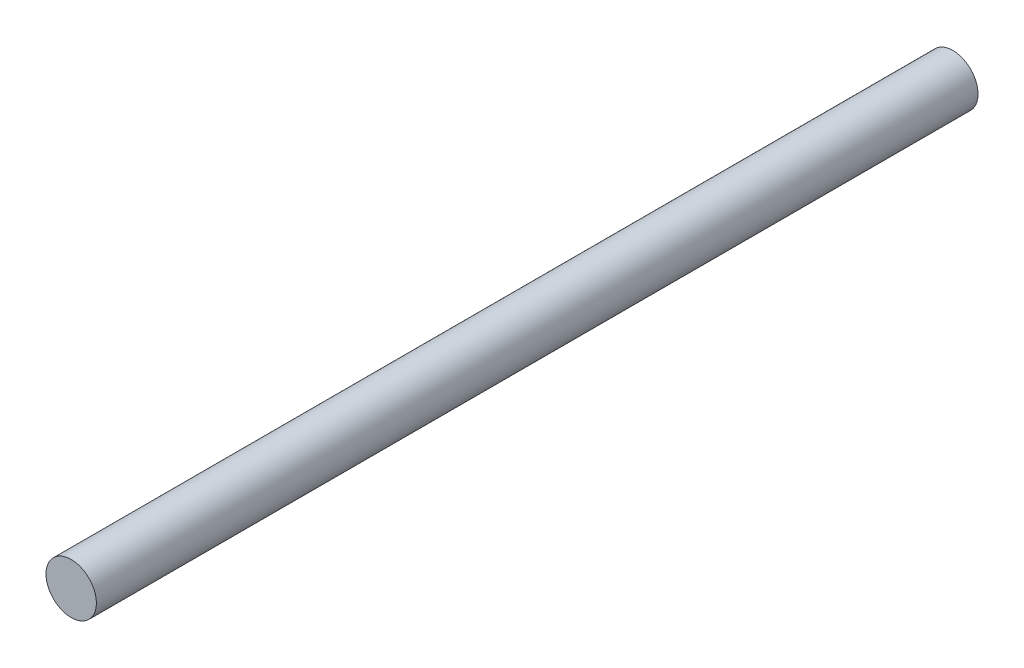
ISO-10303-21;
HEADER;
FILE_DESCRIPTION(('STEP AP214'),'2;1');
FILE_NAME('part.step','',(''),(''),'','','');
FILE_SCHEMA(('AUTOMOTIVE_DESIGN { 1 0 10303 214 1 1 1 1 }'));
ENDSEC;
DATA;
#1=APPLICATION_CONTEXT('core data for automotive mechanical design processes');
#2=APPLICATION_PROTOCOL_DEFINITION('international standard','automotive_design',2000,#1);
#3=PRODUCT_CONTEXT('',#1,'mechanical');
#4=PRODUCT('Part','Part','',(#3));
#5=PRODUCT_RELATED_PRODUCT_CATEGORY('part','',(#4));
#6=PRODUCT_DEFINITION_FORMATION('','',#4);
#7=PRODUCT_DEFINITION_CONTEXT('part definition',#1,'design');
#8=PRODUCT_DEFINITION('design','',#6,#7);
#9=PRODUCT_DEFINITION_SHAPE('','',#8);
#10=(LENGTH_UNIT() NAMED_UNIT(*) SI_UNIT(.MILLI.,.METRE.));
#11=(NAMED_UNIT(*) PLANE_ANGLE_UNIT() SI_UNIT($,.RADIAN.));
#12=(NAMED_UNIT(*) SI_UNIT($,.STERADIAN.) SOLID_ANGLE_UNIT());
#13=UNCERTAINTY_MEASURE_WITH_UNIT(LENGTH_MEASURE(1.E-05),#10,'distance_accuracy_value','');
#14=(GEOMETRIC_REPRESENTATION_CONTEXT(3) GLOBAL_UNCERTAINTY_ASSIGNED_CONTEXT((#13)) GLOBAL_UNIT_ASSIGNED_CONTEXT((#10,
#11,#12)) REPRESENTATION_CONTEXT('',''));
#15=CARTESIAN_POINT('',(0.,0.,0.));
#16=DIRECTION('',(0.,0.,1.));
#17=DIRECTION('',(1.,0.,0.));
#18=AXIS2_PLACEMENT_3D('',#15,#16,#17);
#19=CARTESIAN_POINT('',(0.,0.,84.));
#20=DIRECTION('',(0.,0.,-1.));
#21=DIRECTION('',(-1.,0.,0.));
#22=AXIS2_PLACEMENT_3D('',#19,#20,#21);
#23=CYLINDRICAL_SURFACE('',#22,4.8);
#24=CARTESIAN_POINT('',(0.,0.,84.));
#25=DIRECTION('',(0.,0.,1.));
#26=DIRECTION('',(1.,0.,0.));
#27=AXIS2_PLACEMENT_3D('',#24,#25,#26);
#28=CIRCLE('',#27,4.8);
#29=CARTESIAN_POINT('',(-4.8,0.,84.));
#30=VERTEX_POINT('',#29);
#31=EDGE_CURVE('E10',#30,#30,#28,.T.);
#32=CARTESIAN_POINT('',(0.,0.,-84.));
#33=DIRECTION('',(0.,0.,1.));
#34=DIRECTION('',(1.,0.,0.));
#35=AXIS2_PLACEMENT_3D('',#32,#33,#34);
#36=CIRCLE('',#35,4.8);
#37=CARTESIAN_POINT('',(-4.8,0.,-84.));
#38=VERTEX_POINT('',#37);
#39=EDGE_CURVE('E38',#38,#38,#36,.T.);
#40=CARTESIAN_POINT('',(-4.8,0.,84.));
#41=CARTESIAN_POINT('',(-4.8,0.,82.25));
#42=CARTESIAN_POINT('',(-4.8,0.,80.5));
#43=CARTESIAN_POINT('',(-4.8,0.,77.));
#44=CARTESIAN_POINT('',(-4.8,0.,75.25));
#45=CARTESIAN_POINT('',(-4.8,0.,71.75));
#46=CARTESIAN_POINT('',(-4.8,0.,70.));
#47=CARTESIAN_POINT('',(-4.8,0.,66.5));
#48=CARTESIAN_POINT('',(-4.8,0.,64.75));
#49=CARTESIAN_POINT('',(-4.8,0.,61.25));
#50=CARTESIAN_POINT('',(-4.8,0.,59.5));
#51=CARTESIAN_POINT('',(-4.8,0.,56.));
#52=CARTESIAN_POINT('',(-4.8,0.,54.25));
#53=CARTESIAN_POINT('',(-4.8,0.,50.75));
#54=CARTESIAN_POINT('',(-4.8,0.,49.));
#55=CARTESIAN_POINT('',(-4.8,0.,45.5));
#56=CARTESIAN_POINT('',(-4.8,0.,43.75));
#57=CARTESIAN_POINT('',(-4.8,0.,40.25));
#58=CARTESIAN_POINT('',(-4.8,0.,38.5));
#59=CARTESIAN_POINT('',(-4.8,0.,35.));
#60=CARTESIAN_POINT('',(-4.8,0.,33.25));
#61=CARTESIAN_POINT('',(-4.8,0.,29.75));
#62=CARTESIAN_POINT('',(-4.8,0.,28.));
#63=CARTESIAN_POINT('',(-4.8,0.,24.5));
#64=CARTESIAN_POINT('',(-4.8,0.,22.75));
#65=CARTESIAN_POINT('',(-4.8,0.,19.25));
#66=CARTESIAN_POINT('',(-4.8,0.,17.5));
#67=CARTESIAN_POINT('',(-4.8,0.,14.));
#68=CARTESIAN_POINT('',(-4.8,0.,12.25));
#69=CARTESIAN_POINT('',(-4.8,0.,8.75000000000001));
#70=CARTESIAN_POINT('',(-4.8,0.,7.00000000000001));
#71=CARTESIAN_POINT('',(-4.8,0.,3.5));
#72=CARTESIAN_POINT('',(-4.8,0.,1.75));
#73=CARTESIAN_POINT('',(-4.8,0.,-1.75));
#74=CARTESIAN_POINT('',(-4.8,0.,-3.5));
#75=CARTESIAN_POINT('',(-4.8,0.,-7.00000000000001));
#76=CARTESIAN_POINT('',(-4.8,0.,-8.75000000000001));
#77=CARTESIAN_POINT('',(-4.8,0.,-12.25));
#78=CARTESIAN_POINT('',(-4.8,0.,-14.));
#79=CARTESIAN_POINT('',(-4.8,0.,-17.5));
#80=CARTESIAN_POINT('',(-4.8,0.,-19.25));
#81=CARTESIAN_POINT('',(-4.8,0.,-22.75));
#82=CARTESIAN_POINT('',(-4.8,0.,-24.5));
#83=CARTESIAN_POINT('',(-4.8,0.,-28.));
#84=CARTESIAN_POINT('',(-4.8,0.,-29.75));
#85=CARTESIAN_POINT('',(-4.8,0.,-33.25));
#86=CARTESIAN_POINT('',(-4.8,0.,-35.));
#87=CARTESIAN_POINT('',(-4.8,0.,-38.5));
#88=CARTESIAN_POINT('',(-4.8,0.,-40.25));
#89=CARTESIAN_POINT('',(-4.8,0.,-43.75));
#90=CARTESIAN_POINT('',(-4.8,0.,-45.5));
#91=CARTESIAN_POINT('',(-4.8,0.,-49.));
#92=CARTESIAN_POINT('',(-4.8,0.,-50.75));
#93=CARTESIAN_POINT('',(-4.8,0.,-54.25));
#94=CARTESIAN_POINT('',(-4.8,0.,-56.));
#95=CARTESIAN_POINT('',(-4.8,0.,-59.5));
#96=CARTESIAN_POINT('',(-4.8,0.,-61.25));
#97=CARTESIAN_POINT('',(-4.8,0.,-64.75));
#98=CARTESIAN_POINT('',(-4.8,0.,-66.5));
#99=CARTESIAN_POINT('',(-4.8,0.,-70.));
#100=CARTESIAN_POINT('',(-4.8,0.,-71.75));
#101=CARTESIAN_POINT('',(-4.8,0.,-75.25));
#102=CARTESIAN_POINT('',(-4.8,0.,-77.));
#103=CARTESIAN_POINT('',(-4.8,0.,-80.5));
#104=CARTESIAN_POINT('',(-4.8,0.,-82.25));
#105=CARTESIAN_POINT('',(-4.8,0.,-84.));
#106=B_SPLINE_CURVE_WITH_KNOTS('',3,(#40,#41,#42,#43,#44,#45,#46,#47,#48,#49,#50,#51,#52,#53,
#54,#55,#56,#57,#58,#59,#60,#61,#62,#63,#64,#65,#66,#67,#68,#69,#70,#71,#72,#73,#74,#75,#76,#77,
#78,#79,#80,#81,#82,#83,#84,#85,#86,#87,#88,#89,#90,#91,#92,#93,#94,#95,#96,#97,#98,#99,#100,
#101,#102,#103,#104,#105),.UNSPECIFIED.,.F.,.F.,(4,2,2,2,2,2,2,2,2,2,2,2,2,2,2,2,2,2,2,2,2,2,2,
2,2,2,2,2,2,2,2,2,4),(0.,5.25,10.5,15.75,21.,26.25,31.5,36.75,42.,47.25,52.5,57.75,63.,68.25,
73.5,78.75,84.,89.25,94.5,99.75,105.,110.25,115.5,120.75,126.,131.25,136.5,141.75,147.,152.25,
157.5,162.75,168.),.UNSPECIFIED.);
#107=EDGE_CURVE('BSEAM35',#30,#38,#106,.T.);
#108=ORIENTED_EDGE('',*,*,#31,.F.);
#109=ORIENTED_EDGE('',*,*,#39,.T.);
#110=ORIENTED_EDGE('',*,*,#107,.T.);
#111=ORIENTED_EDGE('',*,*,#107,.F.);
#112=EDGE_LOOP('',(#108,#110,#109,#111));
#113=FACE_BOUND('',#112,.T.);
#114=ADVANCED_FACE('F35',(#113),#23,.T.);
#115=CARTESIAN_POINT('',(0.,0.,84.));
#116=DIRECTION('',(0.,0.,1.));
#117=DIRECTION('',(1.,0.,0.));
#118=AXIS2_PLACEMENT_3D('',#115,#116,#117);
#119=PLANE('',#118);
#120=ORIENTED_EDGE('',*,*,#31,.T.);
#121=EDGE_LOOP('',(#120));
#122=FACE_BOUND('',#121,.T.);
#123=ADVANCED_FACE('F50',(#122),#119,.T.);
#124=CARTESIAN_POINT('',(0.,0.,-84.));
#125=DIRECTION('',(0.,0.,1.));
#126=DIRECTION('',(1.,0.,0.));
#127=AXIS2_PLACEMENT_3D('',#124,#125,#126);
#128=PLANE('',#127);
#129=ORIENTED_EDGE('',*,*,#39,.F.);
#130=EDGE_LOOP('',(#129));
#131=FACE_BOUND('',#130,.T.);
#132=ADVANCED_FACE('F48',(#131),#128,.F.);
#133=CLOSED_SHELL('',(#114,#123,#132));
#134=MANIFOLD_SOLID_BREP('B2',#133);
#135=ADVANCED_BREP_SHAPE_REPRESENTATION('',(#18,#134),#14);
#136=SHAPE_DEFINITION_REPRESENTATION(#9,#135);
ENDSEC;
END-ISO-10303-21;
